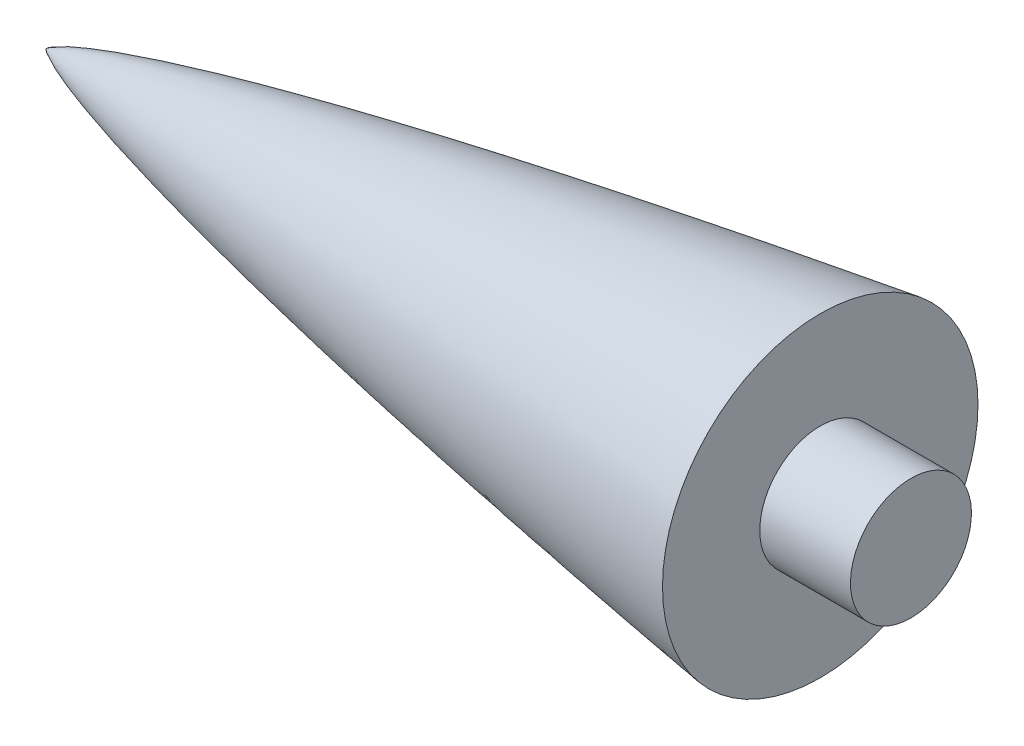
ISO-10303-21;
HEADER;
FILE_DESCRIPTION(('STEP AP214'),'2;1');
FILE_NAME('part.step','',(''),(''),'','','');
FILE_SCHEMA(('AUTOMOTIVE_DESIGN { 1 0 10303 214 1 1 1 1 }'));
ENDSEC;
DATA;
#1=APPLICATION_CONTEXT('core data for automotive mechanical design processes');
#2=APPLICATION_PROTOCOL_DEFINITION('international standard','automotive_design',2000,#1);
#3=PRODUCT_CONTEXT('',#1,'mechanical');
#4=PRODUCT('Part','Part','',(#3));
#5=PRODUCT_RELATED_PRODUCT_CATEGORY('part','',(#4));
#6=PRODUCT_DEFINITION_FORMATION('','',#4);
#7=PRODUCT_DEFINITION_CONTEXT('part definition',#1,'design');
#8=PRODUCT_DEFINITION('design','',#6,#7);
#9=PRODUCT_DEFINITION_SHAPE('','',#8);
#10=(LENGTH_UNIT() NAMED_UNIT(*) SI_UNIT(.MILLI.,.METRE.));
#11=(NAMED_UNIT(*) PLANE_ANGLE_UNIT() SI_UNIT($,.RADIAN.));
#12=(NAMED_UNIT(*) SI_UNIT($,.STERADIAN.) SOLID_ANGLE_UNIT());
#13=UNCERTAINTY_MEASURE_WITH_UNIT(LENGTH_MEASURE(1.E-05),#10,'distance_accuracy_value','');
#14=(GEOMETRIC_REPRESENTATION_CONTEXT(3) GLOBAL_UNCERTAINTY_ASSIGNED_CONTEXT((#13)) GLOBAL_UNIT_ASSIGNED_CONTEXT((#10,
#11,#12)) REPRESENTATION_CONTEXT('',''));
#15=CARTESIAN_POINT('',(0.,0.,0.));
#16=DIRECTION('',(0.,0.,1.));
#17=DIRECTION('',(1.,0.,0.));
#18=AXIS2_PLACEMENT_3D('',#15,#16,#17);
#19=CARTESIAN_POINT('',(162.56,0.,0.));
#20=DIRECTION('',(1.,0.,0.));
#21=DIRECTION('',(0.,1.,0.));
#22=AXIS2_PLACEMENT_3D('',#19,#20,#21);
#23=PLANE('',#22);
#24=CARTESIAN_POINT('',(162.56,0.,0.));
#25=DIRECTION('',(-1.,0.,0.));
#26=DIRECTION('',(0.,-1.,0.));
#27=AXIS2_PLACEMENT_3D('',#24,#25,#26);
#28=CIRCLE('',#27,33.1280498009156);
#29=CARTESIAN_POINT('',(162.56,-33.1280498009156,0.));
#30=VERTEX_POINT('',#29);
#31=EDGE_CURVE('E11',#30,#30,#28,.F.);
#32=ORIENTED_EDGE('',*,*,#31,.T.);
#33=EDGE_LOOP('',(#32));
#34=FACE_BOUND('',#33,.T.);
#35=CARTESIAN_POINT('',(162.56,0.,0.));
#36=DIRECTION('',(1.,0.,0.));
#37=DIRECTION('',(0.,1.,0.));
#38=AXIS2_PLACEMENT_3D('',#35,#36,#37);
#39=CIRCLE('',#38,12.7);
#40=CARTESIAN_POINT('',(162.56,-12.7,0.));
#41=VERTEX_POINT('',#40);
#42=EDGE_CURVE('E54',#41,#41,#39,.T.);
#43=ORIENTED_EDGE('',*,*,#42,.F.);
#44=EDGE_LOOP('',(#43));
#45=FACE_BOUND('',#44,.T.);
#46=ADVANCED_FACE('F35',(#34,#45),#23,.T.);
#47=CARTESIAN_POINT('',(762.,83.841254665666,0.));
#48=CARTESIAN_POINT('',(759.615436090338,83.8348786530274,0.));
#49=CARTESIAN_POINT('',(754.846503833814,83.7859260177921,0.));
#50=CARTESIAN_POINT('',(745.309411706468,83.6327608330306,0.));
#51=CARTESIAN_POINT('',(729.852911101212,83.2590075767634,0.));
#52=CARTESIAN_POINT('',(710.863439025648,82.6553562596267,0.));
#53=CARTESIAN_POINT('',(682.425589554388,81.5391979712966,0.));
#54=CARTESIAN_POINT('',(646.930327878799,79.8372948360595,0.));
#55=CARTESIAN_POINT('',(605.538293136767,77.4858004644496,0.));
#56=CARTESIAN_POINT('',(558.259527801623,74.3703783950666,0.));
#57=CARTESIAN_POINT('',(511.00790004468,70.8684145222591,0.));
#58=CARTESIAN_POINT('',(463.784734461524,67.0021255480557,0.));
#59=CARTESIAN_POINT('',(416.591925171861,62.781349506755,0.));
#60=CARTESIAN_POINT('',(369.432294543761,58.204857708494,0.));
#61=CARTESIAN_POINT('',(322.309575865078,53.2618983416283,0.));
#62=CARTESIAN_POINT('',(275.229416109303,47.9286839235141,0.));
#63=CARTESIAN_POINT('',(228.199436648054,42.167572329428,0.));
#64=CARTESIAN_POINT('',(181.232321927949,35.9138473948452,0.));
#65=CARTESIAN_POINT('',(134.347160824015,29.0668928368045,0.));
#66=CARTESIAN_POINT('',(92.5014071109869,22.2363785489674,0.));
#67=CARTESIAN_POINT('',(58.21468034422,15.8817272260005,0.));
#68=CARTESIAN_POINT('',(33.3857956173297,10.5208699171543,0.));
#69=CARTESIAN_POINT('',(18.9995170679273,6.91730383821913,0.));
#70=CARTESIAN_POINT('',(10.6680057521807,4.4902673249165,0.));
#71=CARTESIAN_POINT('',(6.15457812687039,2.96983830397565,0.));
#72=CARTESIAN_POINT('',(3.71093173791413,2.02979684979071,0.));
#73=CARTESIAN_POINT('',(2.33539055045532,1.4322686637271,0.));
#74=CARTESIAN_POINT('',(1.57274450360088,1.06289215559482,0.));
#75=CARTESIAN_POINT('',(1.12686422152927,0.826333920179848,0.));
#76=CARTESIAN_POINT('',(0.841412680935005,0.663024363572451,0.));
#77=CARTESIAN_POINT('',(0.646496772260084,0.544815951928162,0.));
#78=CARTESIAN_POINT('',(0.476816380111575,0.434147846193127,0.));
#79=CARTESIAN_POINT('',(0.332279693831272,0.331578395878514,0.));
#80=CARTESIAN_POINT('',(0.212062429273832,0.237272492825021,0.));
#81=CARTESIAN_POINT('',(0.127523873180296,0.16317614387605,0.));
#82=CARTESIAN_POINT('',(0.0656948489665144,0.100096678261966,0.));
#83=CARTESIAN_POINT('',(0.0254287850938619,0.0499114059335762,0.));
#84=CARTESIAN_POINT('',(0.00852037979638455,0.0225456416973723,0.));
#85=CARTESIAN_POINT('',(0.00246903573026898,0.00769815196811599,0.));
#86=CARTESIAN_POINT('',(0.,0.,0.));
#87=B_SPLINE_CURVE_WITH_KNOTS('',4,(#47,#48,#49,#50,#51,#52,#53,#54,#55,#56,#57,#58,#59,#60,#61,
#62,#63,#64,#65,#66,#67,#68,#69,#70,#71,#72,#73,#74,#75,#76,#77,#78,#79,#80,#81,#82,#83,#84,#85,
#86),.UNSPECIFIED.,.F.,.F.,(5,1,1,1,1,1,1,1,1,1,1,1,1,1,1,1,1,1,1,1,1,1,1,1,1,1,1,1,1,1,1,1,1,1,
1,1,5),(0.,0.0124161059668282,0.0248322119336565,0.049664423867313,0.0805025666095178,
0.111340709351723,0.173016994026944,0.234693278836645,0.296369564823901,0.358045848720771,
0.419722133463729,0.481398418876491,0.54307470462883,0.604750988677317,0.666427272970698,
0.728103557458164,0.789779842686226,0.851456126777999,0.913132399525486,0.948859992798878,
0.971324348437416,0.983696367274972,0.990338333588904,0.994032978251234,0.996115820711361,
0.997325305761031,0.998144918607654,0.998444153837526,0.998743389067397,0.99903753699717,
0.999331684926943,0.999498763695207,0.999665842463471,0.999832921231736,0.999916460615868,
0.999958230307934,1.),.UNSPECIFIED.);
#88=CARTESIAN_POINT('',(0.,0.,0.));
#89=DIRECTION('',(-1.,0.,0.));
#90=AXIS1_PLACEMENT('',#88,#89);
#91=SURFACE_OF_REVOLUTION('',#87,#90);
#92=CARTESIAN_POINT('',(0.,0.,0.));
#93=VERTEX_POINT('',#92);
#94=VERTEX_LOOP('',#93);
#95=FACE_BOUND('',#94,.T.);
#96=ORIENTED_EDGE('',*,*,#31,.F.);
#97=EDGE_LOOP('',(#96));
#98=FACE_BOUND('',#97,.T.);
#99=ADVANCED_FACE('F37',(#95,#98),#91,.T.);
#100=CARTESIAN_POINT('',(181.61,0.,0.));
#101=DIRECTION('',(-1.,0.,0.));
#102=DIRECTION('',(0.,-1.,0.));
#103=AXIS2_PLACEMENT_3D('',#100,#101,#102);
#104=CYLINDRICAL_SURFACE('',#103,12.7);
#105=CARTESIAN_POINT('',(181.61,0.,0.));
#106=DIRECTION('',(1.,0.,0.));
#107=DIRECTION('',(0.,1.,0.));
#108=AXIS2_PLACEMENT_3D('',#105,#106,#107);
#109=CIRCLE('',#108,12.7);
#110=CARTESIAN_POINT('',(181.61,-12.7,0.));
#111=VERTEX_POINT('',#110);
#112=EDGE_CURVE('E42',#111,#111,#109,.T.);
#113=CARTESIAN_POINT('',(181.61,-12.7,0.));
#114=CARTESIAN_POINT('',(181.4115625,-12.7,0.));
#115=CARTESIAN_POINT('',(181.213125,-12.7,0.));
#116=CARTESIAN_POINT('',(180.81625,-12.7,0.));
#117=CARTESIAN_POINT('',(180.6178125,-12.7,0.));
#118=CARTESIAN_POINT('',(180.2209375,-12.7,0.));
#119=CARTESIAN_POINT('',(180.0225,-12.7,0.));
#120=CARTESIAN_POINT('',(179.625625,-12.7,0.));
#121=CARTESIAN_POINT('',(179.4271875,-12.7,0.));
#122=CARTESIAN_POINT('',(179.0303125,-12.7,0.));
#123=CARTESIAN_POINT('',(178.831875,-12.7,0.));
#124=CARTESIAN_POINT('',(178.435,-12.7,0.));
#125=CARTESIAN_POINT('',(178.2365625,-12.7,0.));
#126=CARTESIAN_POINT('',(177.8396875,-12.7,0.));
#127=CARTESIAN_POINT('',(177.64125,-12.7,0.));
#128=CARTESIAN_POINT('',(177.244375,-12.7,0.));
#129=CARTESIAN_POINT('',(177.0459375,-12.7,0.));
#130=CARTESIAN_POINT('',(176.6490625,-12.7,0.));
#131=CARTESIAN_POINT('',(176.450625,-12.7,0.));
#132=CARTESIAN_POINT('',(176.05375,-12.7,0.));
#133=CARTESIAN_POINT('',(175.8553125,-12.7,0.));
#134=CARTESIAN_POINT('',(175.4584375,-12.7,0.));
#135=CARTESIAN_POINT('',(175.26,-12.7,0.));
#136=CARTESIAN_POINT('',(174.863125,-12.7,0.));
#137=CARTESIAN_POINT('',(174.6646875,-12.7,0.));
#138=CARTESIAN_POINT('',(174.2678125,-12.7,0.));
#139=CARTESIAN_POINT('',(174.069375,-12.7,0.));
#140=CARTESIAN_POINT('',(173.6725,-12.7,0.));
#141=CARTESIAN_POINT('',(173.4740625,-12.7,0.));
#142=CARTESIAN_POINT('',(173.0771875,-12.7,0.));
#143=CARTESIAN_POINT('',(172.87875,-12.7,0.));
#144=CARTESIAN_POINT('',(172.481875,-12.7,0.));
#145=CARTESIAN_POINT('',(172.2834375,-12.7,0.));
#146=CARTESIAN_POINT('',(171.8865625,-12.7,0.));
#147=CARTESIAN_POINT('',(171.688125,-12.7,0.));
#148=CARTESIAN_POINT('',(171.29125,-12.7,0.));
#149=CARTESIAN_POINT('',(171.0928125,-12.7,0.));
#150=CARTESIAN_POINT('',(170.6959375,-12.7,0.));
#151=CARTESIAN_POINT('',(170.4975,-12.7,0.));
#152=CARTESIAN_POINT('',(170.100625,-12.7,0.));
#153=CARTESIAN_POINT('',(169.9021875,-12.7,0.));
#154=CARTESIAN_POINT('',(169.5053125,-12.7,0.));
#155=CARTESIAN_POINT('',(169.306875,-12.7,0.));
#156=CARTESIAN_POINT('',(168.91,-12.7,0.));
#157=CARTESIAN_POINT('',(168.7115625,-12.7,0.));
#158=CARTESIAN_POINT('',(168.3146875,-12.7,0.));
#159=CARTESIAN_POINT('',(168.11625,-12.7,0.));
#160=CARTESIAN_POINT('',(167.719375,-12.7,0.));
#161=CARTESIAN_POINT('',(167.5209375,-12.7,0.));
#162=CARTESIAN_POINT('',(167.1240625,-12.7,0.));
#163=CARTESIAN_POINT('',(166.925625,-12.7,0.));
#164=CARTESIAN_POINT('',(166.52875,-12.7,0.));
#165=CARTESIAN_POINT('',(166.3303125,-12.7,0.));
#166=CARTESIAN_POINT('',(165.9334375,-12.7,0.));
#167=CARTESIAN_POINT('',(165.735,-12.7,0.));
#168=CARTESIAN_POINT('',(165.338125,-12.7,0.));
#169=CARTESIAN_POINT('',(165.1396875,-12.7,0.));
#170=CARTESIAN_POINT('',(164.7428125,-12.7,0.));
#171=CARTESIAN_POINT('',(164.544375,-12.7,0.));
#172=CARTESIAN_POINT('',(164.1475,-12.7,0.));
#173=CARTESIAN_POINT('',(163.9490625,-12.7,0.));
#174=CARTESIAN_POINT('',(163.5521875,-12.7,0.));
#175=CARTESIAN_POINT('',(163.35375,-12.7,0.));
#176=CARTESIAN_POINT('',(162.956875,-12.7,0.));
#177=CARTESIAN_POINT('',(162.7584375,-12.7,0.));
#178=CARTESIAN_POINT('',(162.56,-12.7,0.));
#179=B_SPLINE_CURVE_WITH_KNOTS('',3,(#113,#114,#115,#116,#117,#118,#119,#120,#121,#122,#123,
#124,#125,#126,#127,#128,#129,#130,#131,#132,#133,#134,#135,#136,#137,#138,#139,#140,#141,#142,
#143,#144,#145,#146,#147,#148,#149,#150,#151,#152,#153,#154,#155,#156,#157,#158,#159,#160,#161,
#162,#163,#164,#165,#166,#167,#168,#169,#170,#171,#172,#173,#174,#175,#176,#177,#178),
.UNSPECIFIED.,.F.,.F.,(4,2,2,2,2,2,2,2,2,2,2,2,2,2,2,2,2,2,2,2,2,2,2,2,2,2,2,2,2,2,2,2,4),(0.,
0.5953125,1.190625,1.7859375,2.38125,2.9765625,3.571875,4.1671875,4.7625,5.3578125,5.953125,
6.5484375,7.14375,7.7390625,8.334375,8.92968750000001,9.52500000000001,10.1203125,10.715625,
11.3109375,11.90625,12.5015625,13.096875,13.6921875,14.2875,14.8828125,15.478125,16.0734375,
16.66875,17.2640625,17.859375,18.4546875,19.05),.UNSPECIFIED.);
#180=EDGE_CURVE('BSEAM47',#111,#41,#179,.T.);
#181=ORIENTED_EDGE('',*,*,#112,.F.);
#182=ORIENTED_EDGE('',*,*,#42,.T.);
#183=ORIENTED_EDGE('',*,*,#180,.T.);
#184=ORIENTED_EDGE('',*,*,#180,.F.);
#185=EDGE_LOOP('',(#181,#183,#182,#184));
#186=FACE_BOUND('',#185,.T.);
#187=ADVANCED_FACE('F47',(#186),#104,.T.);
#188=CARTESIAN_POINT('',(181.61,0.,0.));
#189=DIRECTION('',(1.,0.,0.));
#190=DIRECTION('',(0.,1.,0.));
#191=AXIS2_PLACEMENT_3D('',#188,#189,#190);
#192=PLANE('',#191);
#193=ORIENTED_EDGE('',*,*,#112,.T.);
#194=EDGE_LOOP('',(#193));
#195=FACE_BOUND('',#194,.T.);
#196=ADVANCED_FACE('F67',(#195),#192,.T.);
#197=CLOSED_SHELL('',(#46,#99,#187,#196));
#198=MANIFOLD_SOLID_BREP('B2',#197);
#199=ADVANCED_BREP_SHAPE_REPRESENTATION('',(#18,#198),#14);
#200=SHAPE_DEFINITION_REPRESENTATION(#9,#199);
ENDSEC;
END-ISO-10303-21;
